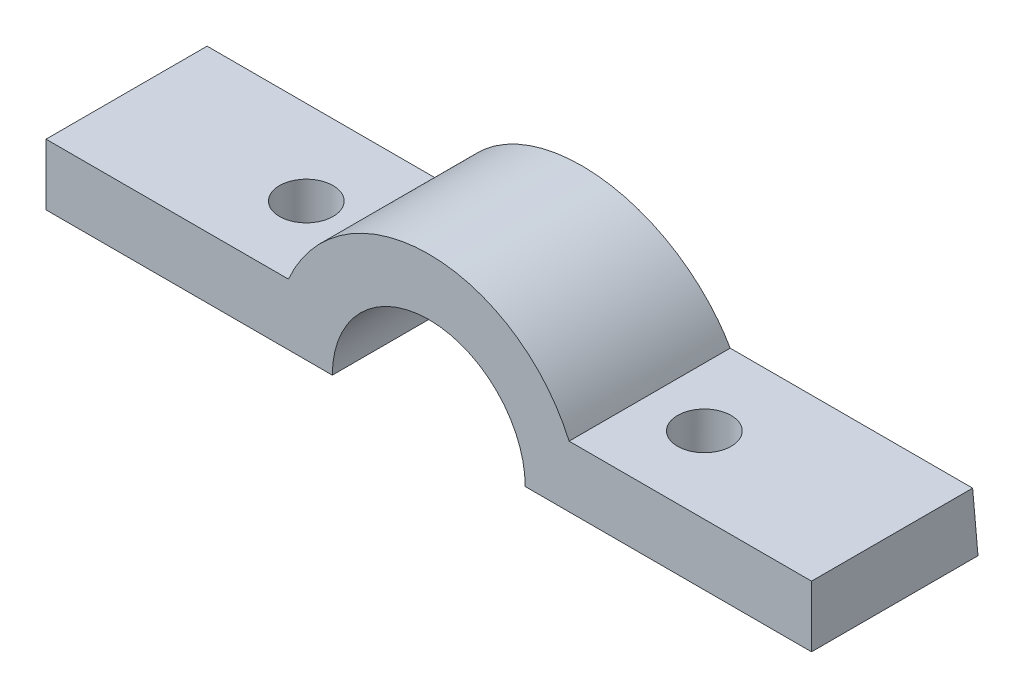
ISO-10303-21;
HEADER;
FILE_DESCRIPTION(('STEP AP214'),'2;1');
FILE_NAME('part.step','',(''),(''),'','','');
FILE_SCHEMA(('AUTOMOTIVE_DESIGN { 1 0 10303 214 1 1 1 1 }'));
ENDSEC;
DATA;
#1=APPLICATION_CONTEXT('core data for automotive mechanical design processes');
#2=APPLICATION_PROTOCOL_DEFINITION('international standard','automotive_design',2000,#1);
#3=PRODUCT_CONTEXT('',#1,'mechanical');
#4=PRODUCT('Part','Part','',(#3));
#5=PRODUCT_RELATED_PRODUCT_CATEGORY('part','',(#4));
#6=PRODUCT_DEFINITION_FORMATION('','',#4);
#7=PRODUCT_DEFINITION_CONTEXT('part definition',#1,'design');
#8=PRODUCT_DEFINITION('design','',#6,#7);
#9=PRODUCT_DEFINITION_SHAPE('','',#8);
#10=(LENGTH_UNIT() NAMED_UNIT(*) SI_UNIT(.MILLI.,.METRE.));
#11=(NAMED_UNIT(*) PLANE_ANGLE_UNIT() SI_UNIT($,.RADIAN.));
#12=(NAMED_UNIT(*) SI_UNIT($,.STERADIAN.) SOLID_ANGLE_UNIT());
#13=UNCERTAINTY_MEASURE_WITH_UNIT(LENGTH_MEASURE(1.E-05),#10,'distance_accuracy_value','');
#14=(GEOMETRIC_REPRESENTATION_CONTEXT(3) GLOBAL_UNCERTAINTY_ASSIGNED_CONTEXT((#13)) GLOBAL_UNIT_ASSIGNED_CONTEXT((#10,
#11,#12)) REPRESENTATION_CONTEXT('',''));
#15=CARTESIAN_POINT('',(0.,0.,0.));
#16=DIRECTION('',(0.,0.,1.));
#17=DIRECTION('',(1.,0.,0.));
#18=AXIS2_PLACEMENT_3D('',#15,#16,#17);
#19=CARTESIAN_POINT('',(31.9445192885683,0.,13.80744));
#20=DIRECTION('',(-1.,0.,0.));
#21=DIRECTION('',(0.,0.,1.));
#22=AXIS2_PLACEMENT_3D('',#19,#20,#21);
#23=PLANE('',#22);
#24=DIRECTION('',(0.,0.996194698091746,0.0871557427476584));
#25=VECTOR('',#24,1.);
#26=CARTESIAN_POINT('',(31.9445192885683,10.4311217758785,0.938132252128049));
#27=LINE('',#26,#25);
#28=CARTESIAN_POINT('',(31.9445192885683,-0.291778932852456,0.));
#29=VERTEX_POINT('',#28);
#30=CARTESIAN_POINT('',(31.9445192885683,4.78822106714754,0.44444241071169));
#31=VERTEX_POINT('',#30);
#32=EDGE_CURVE('E112',#29,#31,#27,.T.);
#33=ORIENTED_EDGE('',*,*,#32,.T.);
#34=DIRECTION('',(0.,0.,-1.));
#35=VECTOR('',#34,1.);
#36=CARTESIAN_POINT('',(31.9445192885683,4.78822106714754,13.80744));
#37=LINE('',#36,#35);
#38=CARTESIAN_POINT('',(31.9445192885683,4.78822106714754,13.80744));
#39=VERTEX_POINT('',#38);
#40=EDGE_CURVE('E54',#39,#31,#37,.T.);
#41=ORIENTED_EDGE('',*,*,#40,.F.);
#42=DIRECTION('',(0.,1.,0.));
#43=VECTOR('',#42,1.);
#44=CARTESIAN_POINT('',(31.9445192885683,0.,13.80744));
#45=LINE('',#44,#43);
#46=CARTESIAN_POINT('',(31.9445192885683,-0.291778932852456,13.80744));
#47=VERTEX_POINT('',#46);
#48=EDGE_CURVE('E165',#47,#39,#45,.T.);
#49=ORIENTED_EDGE('',*,*,#48,.F.);
#50=DIRECTION('',(0.,0.,-1.));
#51=VECTOR('',#50,1.);
#52=CARTESIAN_POINT('',(31.9445192885683,-0.291778932852456,13.80744));
#53=LINE('',#52,#51);
#54=EDGE_CURVE('E11',#47,#29,#53,.T.);
#55=ORIENTED_EDGE('',*,*,#54,.T.);
#56=EDGE_LOOP('',(#33,#41,#49,#55));
#57=FACE_BOUND('',#56,.T.);
#58=ADVANCED_FACE('F44',(#57),#23,.F.);
#59=CARTESIAN_POINT('',(0.,4.78822106714754,13.80744));
#60=DIRECTION('',(0.,-1.,0.));
#61=DIRECTION('',(0.,0.,-1.));
#62=AXIS2_PLACEMENT_3D('',#59,#60,#61);
#63=PLANE('',#62);
#64=CARTESIAN_POINT('',(16.7045192885683,4.78822106714754,7.45744));
#65=DIRECTION('',(0.,-1.,0.));
#66=DIRECTION('',(0.,0.,-1.));
#67=AXIS2_PLACEMENT_3D('',#64,#65,#66);
#68=CIRCLE('',#67,2.22249999999999);
#69=CARTESIAN_POINT('',(16.7045192885683,4.78822106714754,5.23494000000001));
#70=VERTEX_POINT('',#69);
#71=EDGE_CURVE('E237',#70,#70,#68,.T.);
#72=ORIENTED_EDGE('',*,*,#71,.T.);
#73=EDGE_LOOP('',(#72));
#74=FACE_BOUND('',#73,.T.);
#75=DIRECTION('',(-1.,0.,0.));
#76=VECTOR('',#75,1.);
#77=CARTESIAN_POINT('',(11.8342615537561,4.78822106714755,0.44444241071169));
#78=LINE('',#77,#76);
#79=CARTESIAN_POINT('',(11.8342615537561,4.78822106714755,0.44444241071169));
#80=VERTEX_POINT('',#79);
#81=EDGE_CURVE('E161',#31,#80,#78,.T.);
#82=ORIENTED_EDGE('',*,*,#81,.T.);
#83=DIRECTION('',(0.,0.,-1.));
#84=VECTOR('',#83,1.);
#85=CARTESIAN_POINT('',(11.8342615537561,4.78822106714754,13.80744));
#86=LINE('',#85,#84);
#87=CARTESIAN_POINT('',(11.8342615537561,4.78822106714754,13.80744));
#88=VERTEX_POINT('',#87);
#89=EDGE_CURVE('E150',#88,#80,#86,.T.);
#90=ORIENTED_EDGE('',*,*,#89,.F.);
#91=DIRECTION('',(-1.,0.,0.));
#92=VECTOR('',#91,1.);
#93=CARTESIAN_POINT('',(0.,4.78822106714754,13.80744));
#94=LINE('',#93,#92);
#95=EDGE_CURVE('E162',#39,#88,#94,.T.);
#96=ORIENTED_EDGE('',*,*,#95,.F.);
#97=ORIENTED_EDGE('',*,*,#40,.T.);
#98=EDGE_LOOP('',(#82,#90,#96,#97));
#99=FACE_BOUND('',#98,.T.);
#100=ADVANCED_FACE('F159',(#74,#99),#63,.F.);
#101=CARTESIAN_POINT('',(0.194519288568312,-0.291778932852454,13.80744));
#102=DIRECTION('',(0.,0.,-1.));
#103=DIRECTION('',(-1.,0.,0.));
#104=AXIS2_PLACEMENT_3D('',#101,#102,#103);
#105=CYLINDRICAL_SURFACE('',#104,12.7);
#106=CARTESIAN_POINT('',(0.194519288568312,-0.291778932852454,0.));
#107=DIRECTION('',(0.,0.0871557427476584,-0.996194698091746));
#108=DIRECTION('',(0.,-0.996194698091746,-0.0871557427476584));
#109=AXIS2_PLACEMENT_3D('',#106,#107,#108);
#110=ELLIPSE('',#109,12.7485119368005,12.7);
#111=CARTESIAN_POINT('',(-11.4452229766195,4.78822106714754,0.44444241071169));
#112=VERTEX_POINT('',#111);
#113=EDGE_CURVE('E169',#80,#112,#110,.F.);
#114=ORIENTED_EDGE('',*,*,#113,.T.);
#115=DIRECTION('',(0.,0.,-1.));
#116=VECTOR('',#115,1.);
#117=CARTESIAN_POINT('',(-11.4452229766195,4.78822106714754,13.80744));
#118=LINE('',#117,#116);
#119=CARTESIAN_POINT('',(-11.4452229766195,4.78822106714754,13.80744));
#120=VERTEX_POINT('',#119);
#121=EDGE_CURVE('E146',#120,#112,#118,.T.);
#122=ORIENTED_EDGE('',*,*,#121,.F.);
#123=CARTESIAN_POINT('',(0.194519288568312,-0.291778932852454,13.80744));
#124=DIRECTION('',(0.,0.,1.));
#125=DIRECTION('',(1.,0.,0.));
#126=AXIS2_PLACEMENT_3D('',#123,#124,#125);
#127=CIRCLE('',#126,12.7);
#128=EDGE_CURVE('E179',#88,#120,#127,.T.);
#129=ORIENTED_EDGE('',*,*,#128,.F.);
#130=ORIENTED_EDGE('',*,*,#89,.T.);
#131=EDGE_LOOP('',(#114,#122,#129,#130));
#132=FACE_BOUND('',#131,.T.);
#133=ADVANCED_FACE('F213',(#132),#105,.T.);
#134=CARTESIAN_POINT('',(0.,4.78822106714754,13.80744));
#135=DIRECTION('',(0.,1.,0.));
#136=DIRECTION('',(0.,0.,1.));
#137=AXIS2_PLACEMENT_3D('',#134,#135,#136);
#138=PLANE('',#137);
#139=CARTESIAN_POINT('',(-16.3154807114317,4.78822106714754,7.45744));
#140=DIRECTION('',(0.,1.,0.));
#141=DIRECTION('',(0.,0.,1.));
#142=AXIS2_PLACEMENT_3D('',#139,#140,#141);
#143=CIRCLE('',#142,2.2225);
#144=CARTESIAN_POINT('',(-16.3154807114317,4.78822106714754,9.67994));
#145=VERTEX_POINT('',#144);
#146=EDGE_CURVE('E240',#145,#145,#143,.F.);
#147=ORIENTED_EDGE('',*,*,#146,.T.);
#148=EDGE_LOOP('',(#147));
#149=FACE_BOUND('',#148,.T.);
#150=ORIENTED_EDGE('',*,*,#121,.T.);
#151=DIRECTION('',(-1.,0.,0.));
#152=VECTOR('',#151,1.);
#153=CARTESIAN_POINT('',(-31.5554807114317,4.78822106714754,0.44444241071169));
#154=LINE('',#153,#152);
#155=CARTESIAN_POINT('',(-31.5554807114317,4.78822106714754,0.444442410711688));
#156=VERTEX_POINT('',#155);
#157=EDGE_CURVE('E204',#112,#156,#154,.T.);
#158=ORIENTED_EDGE('',*,*,#157,.T.);
#159=DIRECTION('',(0.,0.,-1.));
#160=VECTOR('',#159,1.);
#161=CARTESIAN_POINT('',(-31.5554807114317,4.78822106714754,13.80744));
#162=LINE('',#161,#160);
#163=CARTESIAN_POINT('',(-31.5554807114317,4.78822106714754,13.80744));
#164=VERTEX_POINT('',#163);
#165=EDGE_CURVE('E142',#164,#156,#162,.T.);
#166=ORIENTED_EDGE('',*,*,#165,.F.);
#167=DIRECTION('',(1.,0.,0.));
#168=VECTOR('',#167,1.);
#169=CARTESIAN_POINT('',(0.,4.78822106714754,13.80744));
#170=LINE('',#169,#168);
#171=EDGE_CURVE('E182',#164,#120,#170,.T.);
#172=ORIENTED_EDGE('',*,*,#171,.T.);
#173=EDGE_LOOP('',(#150,#158,#166,#172));
#174=FACE_BOUND('',#173,.T.);
#175=ADVANCED_FACE('F216',(#149,#174),#138,.T.);
#176=CARTESIAN_POINT('',(-31.5554807114317,0.,13.80744));
#177=DIRECTION('',(-1.,0.,0.));
#178=DIRECTION('',(0.,0.,1.));
#179=AXIS2_PLACEMENT_3D('',#176,#177,#178);
#180=PLANE('',#179);
#181=ORIENTED_EDGE('',*,*,#165,.T.);
#182=DIRECTION('',(0.,-0.996194698091746,-0.0871557427476584));
#183=VECTOR('',#182,1.);
#184=CARTESIAN_POINT('',(-31.5554807114317,5.38971008322751,0.497065880854047));
#185=LINE('',#184,#183);
#186=CARTESIAN_POINT('',(-31.5554807114317,-0.291778932852456,0.));
#187=VERTEX_POINT('',#186);
#188=EDGE_CURVE('E122',#156,#187,#185,.T.);
#189=ORIENTED_EDGE('',*,*,#188,.T.);
#190=DIRECTION('',(0.,0.,-1.));
#191=VECTOR('',#190,1.);
#192=CARTESIAN_POINT('',(-31.5554807114317,-0.291778932852456,13.80744));
#193=LINE('',#192,#191);
#194=CARTESIAN_POINT('',(-31.5554807114317,-0.291778932852456,13.80744));
#195=VERTEX_POINT('',#194);
#196=EDGE_CURVE('E133',#195,#187,#193,.T.);
#197=ORIENTED_EDGE('',*,*,#196,.F.);
#198=DIRECTION('',(0.,1.,0.));
#199=VECTOR('',#198,1.);
#200=CARTESIAN_POINT('',(-31.5554807114317,0.,13.80744));
#201=LINE('',#200,#199);
#202=EDGE_CURVE('E186',#195,#164,#201,.T.);
#203=ORIENTED_EDGE('',*,*,#202,.T.);
#204=EDGE_LOOP('',(#181,#189,#197,#203));
#205=FACE_BOUND('',#204,.T.);
#206=ADVANCED_FACE('F202',(#205),#180,.T.);
#207=CARTESIAN_POINT('',(0.194519288568312,-0.291778932852454,13.80744));
#208=DIRECTION('',(0.,0.,-1.));
#209=DIRECTION('',(-1.,0.,0.));
#210=AXIS2_PLACEMENT_3D('',#207,#208,#209);
#211=CYLINDRICAL_SURFACE('',#210,8.);
#212=DIRECTION('',(0.,0.,-1.));
#213=VECTOR('',#212,1.);
#214=CARTESIAN_POINT('',(-7.80548071143169,-0.291778932852454,13.80744));
#215=LINE('',#214,#213);
#216=CARTESIAN_POINT('',(-7.80548071143169,-0.291778932852454,13.80744));
#217=VERTEX_POINT('',#216);
#218=CARTESIAN_POINT('',(-7.80548071143169,-0.291778932852454,0.));
#219=VERTEX_POINT('',#218);
#220=EDGE_CURVE('E119',#217,#219,#215,.T.);
#221=ORIENTED_EDGE('',*,*,#220,.T.);
#222=CARTESIAN_POINT('',(0.194519288568312,-0.291778932852454,0.));
#223=DIRECTION('',(0.,0.0871557427476584,-0.996194698091746));
#224=DIRECTION('',(0.,-0.996194698091746,-0.0871557427476584));
#225=AXIS2_PLACEMENT_3D('',#222,#223,#224);
#226=ELLIPSE('',#225,8.03055870034678,8.);
#227=CARTESIAN_POINT('',(8.19451928856831,-0.291778932852454,0.));
#228=VERTEX_POINT('',#227);
#229=EDGE_CURVE('E109',#219,#228,#226,.T.);
#230=ORIENTED_EDGE('',*,*,#229,.T.);
#231=DIRECTION('',(0.,0.,-1.));
#232=VECTOR('',#231,1.);
#233=CARTESIAN_POINT('',(8.19451928856831,-0.291778932852454,13.80744));
#234=LINE('',#233,#232);
#235=CARTESIAN_POINT('',(8.19451928856831,-0.291778932852454,13.80744));
#236=VERTEX_POINT('',#235);
#237=EDGE_CURVE('E61',#236,#228,#234,.T.);
#238=ORIENTED_EDGE('',*,*,#237,.F.);
#239=CARTESIAN_POINT('',(0.194519288568312,-0.291778932852454,13.80744));
#240=DIRECTION('',(0.,0.,1.));
#241=DIRECTION('',(1.,0.,0.));
#242=AXIS2_PLACEMENT_3D('',#239,#240,#241);
#243=CIRCLE('',#242,8.);
#244=EDGE_CURVE('E129',#236,#217,#243,.T.);
#245=ORIENTED_EDGE('',*,*,#244,.T.);
#246=EDGE_LOOP('',(#221,#230,#238,#245));
#247=FACE_BOUND('',#246,.T.);
#248=ADVANCED_FACE('F117',(#247),#211,.F.);
#249=CARTESIAN_POINT('',(0.,-0.291778932852454,13.80744));
#250=DIRECTION('',(0.,-1.,0.));
#251=DIRECTION('',(0.,0.,-1.));
#252=AXIS2_PLACEMENT_3D('',#249,#250,#251);
#253=PLANE('',#252);
#254=CARTESIAN_POINT('',(16.7045192885683,-0.291778932852454,7.45744));
#255=DIRECTION('',(0.,1.,0.));
#256=DIRECTION('',(0.,0.,1.));
#257=AXIS2_PLACEMENT_3D('',#254,#255,#256);
#258=CIRCLE('',#257,2.22249999999999);
#259=CARTESIAN_POINT('',(16.7045192885683,-0.291778932852454,9.67994));
#260=VERTEX_POINT('',#259);
#261=EDGE_CURVE('E241',#260,#260,#258,.T.);
#262=ORIENTED_EDGE('',*,*,#261,.T.);
#263=EDGE_LOOP('',(#262));
#264=FACE_BOUND('',#263,.T.);
#265=DIRECTION('',(-1.,0.,0.));
#266=VECTOR('',#265,1.);
#267=CARTESIAN_POINT('',(0.,-0.291778932852454,0.));
#268=LINE('',#267,#266);
#269=EDGE_CURVE('E107',#29,#228,#268,.T.);
#270=ORIENTED_EDGE('',*,*,#269,.F.);
#271=ORIENTED_EDGE('',*,*,#54,.F.);
#272=DIRECTION('',(-1.,0.,0.));
#273=VECTOR('',#272,1.);
#274=CARTESIAN_POINT('',(0.,-0.291778932852454,13.80744));
#275=LINE('',#274,#273);
#276=EDGE_CURVE('E126',#47,#236,#275,.T.);
#277=ORIENTED_EDGE('',*,*,#276,.T.);
#278=ORIENTED_EDGE('',*,*,#237,.T.);
#279=EDGE_LOOP('',(#270,#271,#277,#278));
#280=FACE_BOUND('',#279,.T.);
#281=ADVANCED_FACE('F46',(#264,#280),#253,.T.);
#282=CARTESIAN_POINT('',(0.,-0.291778932852454,13.80744));
#283=DIRECTION('',(0.,1.,0.));
#284=DIRECTION('',(0.,0.,1.));
#285=AXIS2_PLACEMENT_3D('',#282,#283,#284);
#286=PLANE('',#285);
#287=CARTESIAN_POINT('',(-16.3154807114317,-0.291778932852454,7.45744));
#288=DIRECTION('',(0.,-1.,0.));
#289=DIRECTION('',(0.,0.,-1.));
#290=AXIS2_PLACEMENT_3D('',#287,#288,#289);
#291=CIRCLE('',#290,2.2225);
#292=CARTESIAN_POINT('',(-16.3154807114317,-0.291778932852454,5.23494));
#293=VERTEX_POINT('',#292);
#294=EDGE_CURVE('E123',#293,#293,#291,.T.);
#295=ORIENTED_EDGE('',*,*,#294,.F.);
#296=EDGE_LOOP('',(#295));
#297=FACE_BOUND('',#296,.T.);
#298=DIRECTION('',(1.,0.,0.));
#299=VECTOR('',#298,1.);
#300=CARTESIAN_POINT('',(0.,-0.291778932852454,0.));
#301=LINE('',#300,#299);
#302=EDGE_CURVE('E115',#187,#219,#301,.T.);
#303=ORIENTED_EDGE('',*,*,#302,.T.);
#304=ORIENTED_EDGE('',*,*,#220,.F.);
#305=DIRECTION('',(1.,0.,0.));
#306=VECTOR('',#305,1.);
#307=CARTESIAN_POINT('',(0.,-0.291778932852454,13.80744));
#308=LINE('',#307,#306);
#309=EDGE_CURVE('E135',#195,#217,#308,.T.);
#310=ORIENTED_EDGE('',*,*,#309,.F.);
#311=ORIENTED_EDGE('',*,*,#196,.T.);
#312=EDGE_LOOP('',(#303,#304,#310,#311));
#313=FACE_BOUND('',#312,.T.);
#314=ADVANCED_FACE('F197',(#297,#313),#286,.F.);
#315=CARTESIAN_POINT('',(0.,0.,13.80744));
#316=DIRECTION('',(0.,0.,1.));
#317=DIRECTION('',(1.,0.,0.));
#318=AXIS2_PLACEMENT_3D('',#315,#316,#317);
#319=PLANE('',#318);
#320=ORIENTED_EDGE('',*,*,#276,.F.);
#321=ORIENTED_EDGE('',*,*,#48,.T.);
#322=ORIENTED_EDGE('',*,*,#95,.T.);
#323=ORIENTED_EDGE('',*,*,#128,.T.);
#324=ORIENTED_EDGE('',*,*,#171,.F.);
#325=ORIENTED_EDGE('',*,*,#202,.F.);
#326=ORIENTED_EDGE('',*,*,#309,.T.);
#327=ORIENTED_EDGE('',*,*,#244,.F.);
#328=EDGE_LOOP('',(#320,#321,#322,#323,#324,#325,#326,#327));
#329=FACE_BOUND('',#328,.T.);
#330=ADVANCED_FACE('F194',(#329),#319,.T.);
#331=CARTESIAN_POINT('',(0.,-0.00221638880686443,0.0253334399857152));
#332=DIRECTION('',(0.,0.0871557427476584,-0.996194698091746));
#333=DIRECTION('',(0.,0.996194698091746,0.0871557427476584));
#334=AXIS2_PLACEMENT_3D('',#331,#332,#333);
#335=PLANE('',#334);
#336=ORIENTED_EDGE('',*,*,#32,.F.);
#337=ORIENTED_EDGE('',*,*,#269,.T.);
#338=ORIENTED_EDGE('',*,*,#229,.F.);
#339=ORIENTED_EDGE('',*,*,#302,.F.);
#340=ORIENTED_EDGE('',*,*,#188,.F.);
#341=ORIENTED_EDGE('',*,*,#157,.F.);
#342=ORIENTED_EDGE('',*,*,#113,.F.);
#343=ORIENTED_EDGE('',*,*,#81,.F.);
#344=EDGE_LOOP('',(#336,#337,#338,#339,#340,#341,#342,#343));
#345=FACE_BOUND('',#344,.T.);
#346=ADVANCED_FACE('F108',(#345),#335,.T.);
#347=CARTESIAN_POINT('',(-16.3154807114317,12.4092210671475,7.45744));
#348=DIRECTION('',(0.,-1.,0.));
#349=DIRECTION('',(0.,0.,-1.));
#350=AXIS2_PLACEMENT_3D('',#347,#348,#349);
#351=CYLINDRICAL_SURFACE('',#350,2.2225);
#352=ORIENTED_EDGE('',*,*,#146,.F.);
#353=EDGE_LOOP('',(#352));
#354=FACE_BOUND('',#353,.T.);
#355=ORIENTED_EDGE('',*,*,#294,.T.);
#356=EDGE_LOOP('',(#355));
#357=FACE_BOUND('',#356,.T.);
#358=ADVANCED_FACE('F252',(#354,#357),#351,.F.);
#359=CARTESIAN_POINT('',(16.7045192885683,12.4092210671475,7.45744));
#360=DIRECTION('',(0.,-1.,0.));
#361=DIRECTION('',(0.,0.,-1.));
#362=AXIS2_PLACEMENT_3D('',#359,#360,#361);
#363=CYLINDRICAL_SURFACE('',#362,2.22249999999999);
#364=ORIENTED_EDGE('',*,*,#261,.F.);
#365=EDGE_LOOP('',(#364));
#366=FACE_BOUND('',#365,.T.);
#367=ORIENTED_EDGE('',*,*,#71,.F.);
#368=EDGE_LOOP('',(#367));
#369=FACE_BOUND('',#368,.T.);
#370=ADVANCED_FACE('F267',(#366,#369),#363,.F.);
#371=CLOSED_SHELL('',(#58,#100,#133,#175,#206,#248,#281,#314,#330,#346,#358,#370));
#372=MANIFOLD_SOLID_BREP('B2',#371);
#373=ADVANCED_BREP_SHAPE_REPRESENTATION('',(#18,#372),#14);
#374=SHAPE_DEFINITION_REPRESENTATION(#9,#373);
ENDSEC;
END-ISO-10303-21;
